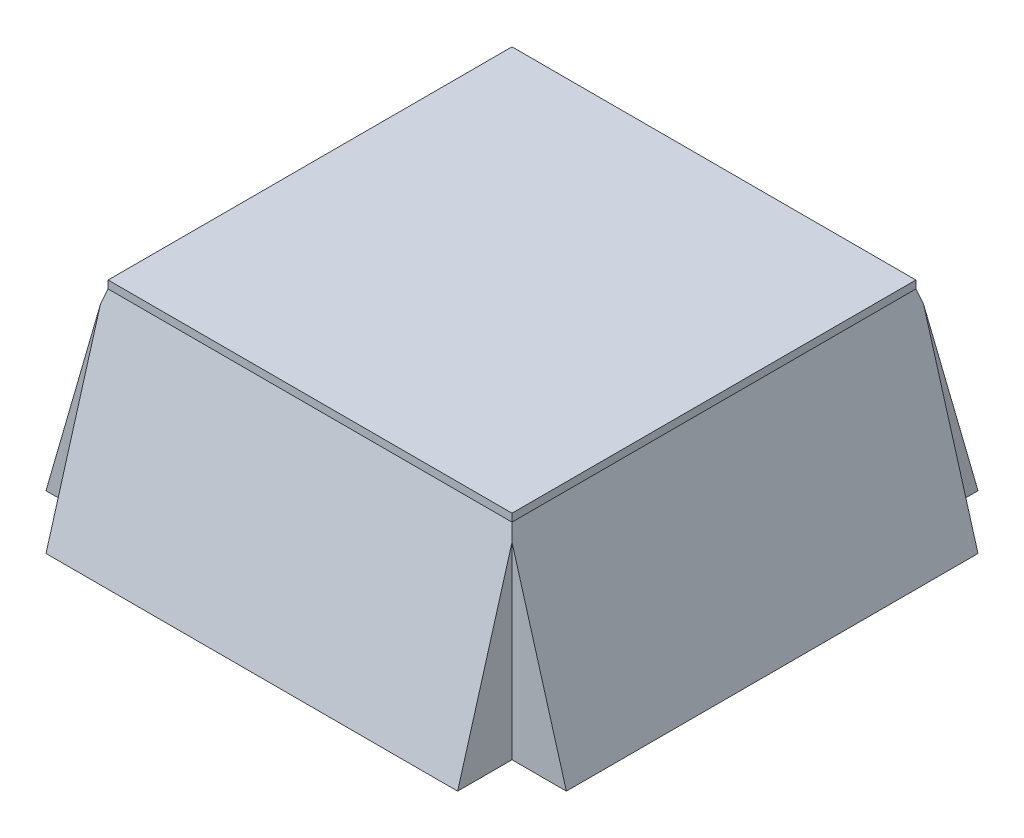
ISO-10303-21;
HEADER;
FILE_DESCRIPTION(('STEP AP214'),'2;1');
FILE_NAME('part.step','',(''),(''),'','','');
FILE_SCHEMA(('AUTOMOTIVE_DESIGN { 1 0 10303 214 1 1 1 1 }'));
ENDSEC;
DATA;
#1=APPLICATION_CONTEXT('core data for automotive mechanical design processes');
#2=APPLICATION_PROTOCOL_DEFINITION('international standard','automotive_design',2000,#1);
#3=PRODUCT_CONTEXT('',#1,'mechanical');
#4=PRODUCT('Part','Part','',(#3));
#5=PRODUCT_RELATED_PRODUCT_CATEGORY('part','',(#4));
#6=PRODUCT_DEFINITION_FORMATION('','',#4);
#7=PRODUCT_DEFINITION_CONTEXT('part definition',#1,'design');
#8=PRODUCT_DEFINITION('design','',#6,#7);
#9=PRODUCT_DEFINITION_SHAPE('','',#8);
#10=(LENGTH_UNIT() NAMED_UNIT(*) SI_UNIT(.MILLI.,.METRE.));
#11=(NAMED_UNIT(*) PLANE_ANGLE_UNIT() SI_UNIT($,.RADIAN.));
#12=(NAMED_UNIT(*) SI_UNIT($,.STERADIAN.) SOLID_ANGLE_UNIT());
#13=UNCERTAINTY_MEASURE_WITH_UNIT(LENGTH_MEASURE(1.E-05),#10,'distance_accuracy_value','');
#14=(GEOMETRIC_REPRESENTATION_CONTEXT(3) GLOBAL_UNCERTAINTY_ASSIGNED_CONTEXT((#13)) GLOBAL_UNIT_ASSIGNED_CONTEXT((#10,
#11,#12)) REPRESENTATION_CONTEXT('',''));
#15=CARTESIAN_POINT('',(0.,0.,0.));
#16=DIRECTION('',(0.,0.,1.));
#17=DIRECTION('',(1.,0.,0.));
#18=AXIS2_PLACEMENT_3D('',#15,#16,#17);
#19=CARTESIAN_POINT('',(0.,0.,67.));
#20=DIRECTION('',(0.,1.,0.));
#21=DIRECTION('',(0.,0.,1.));
#22=AXIS2_PLACEMENT_3D('',#19,#20,#21);
#23=PLANE('',#22);
#24=DIRECTION('',(1.,0.,0.));
#25=VECTOR('',#24,1.);
#26=CARTESIAN_POINT('',(65.7115384615385,0.,58.5));
#27=LINE('',#26,#25);
#28=CARTESIAN_POINT('',(58.5,0.,58.5));
#29=VERTEX_POINT('',#28);
#30=CARTESIAN_POINT('',(65.7115384615385,0.,58.5));
#31=VERTEX_POINT('',#30);
#32=EDGE_CURVE('E281',#29,#31,#27,.T.);
#33=ORIENTED_EDGE('',*,*,#32,.T.);
#34=DIRECTION('',(0.,0.,-1.));
#35=VECTOR('',#34,1.);
#36=CARTESIAN_POINT('',(65.7115384615385,0.,58.5));
#37=LINE('',#36,#35);
#38=CARTESIAN_POINT('',(65.7115384615385,0.,8.5));
#39=VERTEX_POINT('',#38);
#40=EDGE_CURVE('E298',#31,#39,#37,.T.);
#41=ORIENTED_EDGE('',*,*,#40,.T.);
#42=DIRECTION('',(1.,0.,0.));
#43=VECTOR('',#42,1.);
#44=CARTESIAN_POINT('',(65.7115384615385,0.,8.5));
#45=LINE('',#44,#43);
#46=CARTESIAN_POINT('',(58.5,0.,8.5));
#47=VERTEX_POINT('',#46);
#48=EDGE_CURVE('E273',#47,#39,#45,.T.);
#49=ORIENTED_EDGE('',*,*,#48,.F.);
#50=DIRECTION('',(0.,0.,-1.));
#51=VECTOR('',#50,1.);
#52=CARTESIAN_POINT('',(58.5,0.,67.));
#53=LINE('',#52,#51);
#54=CARTESIAN_POINT('',(58.5,0.,1.28846153846154));
#55=VERTEX_POINT('',#54);
#56=EDGE_CURVE('E425',#47,#55,#53,.T.);
#57=ORIENTED_EDGE('',*,*,#56,.T.);
#58=DIRECTION('',(-1.,0.,0.));
#59=VECTOR('',#58,1.);
#60=CARTESIAN_POINT('',(58.5,0.,1.28846153846154));
#61=LINE('',#60,#59);
#62=CARTESIAN_POINT('',(8.5,0.,1.28846153846154));
#63=VERTEX_POINT('',#62);
#64=EDGE_CURVE('E333',#55,#63,#61,.T.);
#65=ORIENTED_EDGE('',*,*,#64,.T.);
#66=DIRECTION('',(0.,0.,1.));
#67=VECTOR('',#66,1.);
#68=CARTESIAN_POINT('',(8.50000000000001,0.,67.));
#69=LINE('',#68,#67);
#70=CARTESIAN_POINT('',(8.50000000000001,0.,8.5));
#71=VERTEX_POINT('',#70);
#72=EDGE_CURVE('E422',#63,#71,#69,.T.);
#73=ORIENTED_EDGE('',*,*,#72,.T.);
#74=CARTESIAN_POINT('',(1.28846153846154,0.,8.5));
#75=VERTEX_POINT('',#74);
#76=EDGE_CURVE('E274',#75,#71,#45,.T.);
#77=ORIENTED_EDGE('',*,*,#76,.F.);
#78=DIRECTION('',(0.,0.,-1.));
#79=VECTOR('',#78,1.);
#80=CARTESIAN_POINT('',(1.28846153846154,0.,58.5));
#81=LINE('',#80,#79);
#82=CARTESIAN_POINT('',(1.28846153846154,0.,58.5));
#83=VERTEX_POINT('',#82);
#84=EDGE_CURVE('E290',#83,#75,#81,.T.);
#85=ORIENTED_EDGE('',*,*,#84,.F.);
#86=CARTESIAN_POINT('',(8.50000000000001,0.,58.5));
#87=VERTEX_POINT('',#86);
#88=EDGE_CURVE('E282',#83,#87,#27,.T.);
#89=ORIENTED_EDGE('',*,*,#88,.T.);
#90=CARTESIAN_POINT('',(8.5,0.,65.7115384615385));
#91=VERTEX_POINT('',#90);
#92=EDGE_CURVE('E421',#87,#91,#69,.T.);
#93=ORIENTED_EDGE('',*,*,#92,.T.);
#94=DIRECTION('',(-1.,0.,0.));
#95=VECTOR('',#94,1.);
#96=CARTESIAN_POINT('',(58.5,0.,65.7115384615385));
#97=LINE('',#96,#95);
#98=CARTESIAN_POINT('',(58.5,0.,65.7115384615385));
#99=VERTEX_POINT('',#98);
#100=EDGE_CURVE('E323',#99,#91,#97,.T.);
#101=ORIENTED_EDGE('',*,*,#100,.F.);
#102=EDGE_CURVE('E426',#99,#29,#53,.T.);
#103=ORIENTED_EDGE('',*,*,#102,.T.);
#104=EDGE_LOOP('',(#33,#41,#49,#57,#65,#73,#77,#85,#89,#93,#101,#103));
#105=FACE_BOUND('',#104,.T.);
#106=DIRECTION('',(0.,0.,1.));
#107=VECTOR('',#106,1.);
#108=CARTESIAN_POINT('',(60.0000000000006,0.,0.));
#109=LINE('',#108,#107);
#110=CARTESIAN_POINT('',(60.0000000000006,0.,0.));
#111=VERTEX_POINT('',#110);
#112=CARTESIAN_POINT('',(60.0000000000007,0.,6.99999999999991));
#113=VERTEX_POINT('',#112);
#114=EDGE_CURVE('E48',#111,#113,#109,.T.);
#115=ORIENTED_EDGE('',*,*,#114,.T.);
#116=DIRECTION('',(-1.,0.,0.));
#117=VECTOR('',#116,1.);
#118=CARTESIAN_POINT('',(67.0000000000007,0.,6.99999999999988));
#119=LINE('',#118,#117);
#120=CARTESIAN_POINT('',(67.0000000000007,0.,6.99999999999988));
#121=VERTEX_POINT('',#120);
#122=EDGE_CURVE('E248',#121,#113,#119,.T.);
#123=ORIENTED_EDGE('',*,*,#122,.F.);
#124=DIRECTION('',(0.,0.,-1.));
#125=VECTOR('',#124,1.);
#126=CARTESIAN_POINT('',(67.,0.,67.));
#127=LINE('',#126,#125);
#128=CARTESIAN_POINT('',(67.,0.,60.));
#129=VERTEX_POINT('',#128);
#130=EDGE_CURVE('E415',#129,#121,#127,.T.);
#131=ORIENTED_EDGE('',*,*,#130,.F.);
#132=DIRECTION('',(-1.,0.,0.));
#133=VECTOR('',#132,1.);
#134=CARTESIAN_POINT('',(67.,0.,60.));
#135=LINE('',#134,#133);
#136=CARTESIAN_POINT('',(60.,0.,60.));
#137=VERTEX_POINT('',#136);
#138=EDGE_CURVE('E245',#129,#137,#135,.T.);
#139=ORIENTED_EDGE('',*,*,#138,.T.);
#140=DIRECTION('',(0.,0.,-1.));
#141=VECTOR('',#140,1.);
#142=CARTESIAN_POINT('',(60.,0.,67.));
#143=LINE('',#142,#141);
#144=CARTESIAN_POINT('',(60.,0.,67.));
#145=VERTEX_POINT('',#144);
#146=EDGE_CURVE('E257',#145,#137,#143,.T.);
#147=ORIENTED_EDGE('',*,*,#146,.F.);
#148=DIRECTION('',(1.,0.,0.));
#149=VECTOR('',#148,1.);
#150=CARTESIAN_POINT('',(0.,0.,67.));
#151=LINE('',#150,#149);
#152=CARTESIAN_POINT('',(7.00000000000034,0.,67.));
#153=VERTEX_POINT('',#152);
#154=EDGE_CURVE('E405',#153,#145,#151,.T.);
#155=ORIENTED_EDGE('',*,*,#154,.F.);
#156=DIRECTION('',(0.,0.,-1.));
#157=VECTOR('',#156,1.);
#158=CARTESIAN_POINT('',(7.00000000000035,0.,66.9999999999995));
#159=LINE('',#158,#157);
#160=CARTESIAN_POINT('',(7.00000000000028,0.,59.9999999999995));
#161=VERTEX_POINT('',#160);
#162=EDGE_CURVE('E238',#153,#161,#159,.T.);
#163=ORIENTED_EDGE('',*,*,#162,.T.);
#164=DIRECTION('',(1.,0.,0.));
#165=VECTOR('',#164,1.);
#166=CARTESIAN_POINT('',(2.63677968348475E-13,0.,59.9999999999996));
#167=LINE('',#166,#165);
#168=CARTESIAN_POINT('',(2.63677968348475E-13,0.,59.9999999999996));
#169=VERTEX_POINT('',#168);
#170=EDGE_CURVE('E242',#169,#161,#167,.T.);
#171=ORIENTED_EDGE('',*,*,#170,.F.);
#172=DIRECTION('',(0.,0.,-1.));
#173=VECTOR('',#172,1.);
#174=CARTESIAN_POINT('',(0.,0.,67.));
#175=LINE('',#174,#173);
#176=CARTESIAN_POINT('',(5.68989300120393E-13,0.,6.99999999999949));
#177=VERTEX_POINT('',#176);
#178=EDGE_CURVE('E418',#169,#177,#175,.T.);
#179=ORIENTED_EDGE('',*,*,#178,.T.);
#180=DIRECTION('',(1.,0.,0.));
#181=VECTOR('',#180,1.);
#182=CARTESIAN_POINT('',(5.68989300120393E-13,0.,6.99999999999949));
#183=LINE('',#182,#181);
#184=CARTESIAN_POINT('',(7.00000000000058,0.,6.99999999999944));
#185=VERTEX_POINT('',#184);
#186=EDGE_CURVE('E247',#177,#185,#183,.T.);
#187=ORIENTED_EDGE('',*,*,#186,.T.);
#188=DIRECTION('',(0.,0.,1.));
#189=VECTOR('',#188,1.);
#190=CARTESIAN_POINT('',(7.00000000000053,0.,-5.68989300120393E-13));
#191=LINE('',#190,#189);
#192=CARTESIAN_POINT('',(7.00000000000053,0.,-5.68989300120393E-13));
#193=VERTEX_POINT('',#192);
#194=EDGE_CURVE('E239',#193,#185,#191,.T.);
#195=ORIENTED_EDGE('',*,*,#194,.F.);
#196=DIRECTION('',(1.,0.,0.));
#197=VECTOR('',#196,1.);
#198=CARTESIAN_POINT('',(0.,0.,0.));
#199=LINE('',#198,#197);
#200=EDGE_CURVE('E404',#193,#111,#199,.T.);
#201=ORIENTED_EDGE('',*,*,#200,.T.);
#202=EDGE_LOOP('',(#115,#123,#131,#139,#147,#155,#163,#171,#179,#187,#195,#201));
#203=FACE_BOUND('',#202,.T.);
#204=ADVANCED_FACE('F33',(#105,#203),#23,.F.);
#205=CARTESIAN_POINT('',(7.5,26.,67.));
#206=DIRECTION('',(0.960823591180895,-0.277160651302181,0.));
#207=DIRECTION('',(0.277160651302181,0.960823591180895,0.));
#208=AXIS2_PLACEMENT_3D('',#205,#206,#207);
#209=PLANE('',#208);
#210=DIRECTION('',(0.277160651302181,0.960823591180895,0.));
#211=VECTOR('',#210,1.);
#212=CARTESIAN_POINT('',(7.49999999999997,25.9999999999999,6.99999999999944));
#213=LINE('',#212,#211);
#214=CARTESIAN_POINT('',(7.0000000000006,24.2666666666688,7.00000000000063));
#215=VERTEX_POINT('',#214);
#216=EDGE_CURVE('E268',#177,#215,#213,.T.);
#217=ORIENTED_EDGE('',*,*,#216,.F.);
#218=ORIENTED_EDGE('',*,*,#178,.F.);
#219=DIRECTION('',(0.277160651302181,0.960823591180895,0.));
#220=VECTOR('',#219,1.);
#221=CARTESIAN_POINT('',(7.49999999999999,26.,59.9999999999995));
#222=LINE('',#221,#220);
#223=CARTESIAN_POINT('',(7.00000000000028,24.2666666666682,59.9999999999995));
#224=VERTEX_POINT('',#223);
#225=EDGE_CURVE('E265',#169,#224,#222,.T.);
#226=ORIENTED_EDGE('',*,*,#225,.T.);
#227=DIRECTION('',(-0.267091713673411,-0.925917940734491,0.267091713673411));
#228=VECTOR('',#227,1.);
#229=CARTESIAN_POINT('',(6.9649651236525,24.145212428662,60.0350348763475));
#230=LINE('',#229,#228);
#231=CARTESIAN_POINT('',(7.50000000000001,26.,59.5));
#232=VERTEX_POINT('',#231);
#233=EDGE_CURVE('E401',#232,#224,#230,.T.);
#234=ORIENTED_EDGE('',*,*,#233,.F.);
#235=DIRECTION('',(0.,0.,-1.));
#236=VECTOR('',#235,1.);
#237=CARTESIAN_POINT('',(7.5,26.,67.));
#238=LINE('',#237,#236);
#239=CARTESIAN_POINT('',(7.50000000000001,26.,7.5));
#240=VERTEX_POINT('',#239);
#241=EDGE_CURVE('E408',#232,#240,#238,.T.);
#242=ORIENTED_EDGE('',*,*,#241,.T.);
#243=DIRECTION('',(0.267091713673411,0.925917940734491,0.267091713673411));
#244=VECTOR('',#243,1.);
#245=CARTESIAN_POINT('',(11.7446100190235,40.714648065948,11.7446100190235));
#246=LINE('',#245,#244);
#247=EDGE_CURVE('E396',#215,#240,#246,.T.);
#248=ORIENTED_EDGE('',*,*,#247,.F.);
#249=EDGE_LOOP('',(#217,#218,#226,#234,#242,#248));
#250=FACE_BOUND('',#249,.T.);
#251=ADVANCED_FACE('F35',(#250),#209,.F.);
#252=CARTESIAN_POINT('',(67.,0.,67.));
#253=DIRECTION('',(-0.960823591180894,-0.277160651302181,0.));
#254=DIRECTION('',(0.277160651302181,-0.960823591180895,0.));
#255=AXIS2_PLACEMENT_3D('',#252,#253,#254);
#256=PLANE('',#255);
#257=ORIENTED_EDGE('',*,*,#130,.T.);
#258=DIRECTION('',(-0.277160651302181,0.960823591180895,0.));
#259=VECTOR('',#258,1.);
#260=CARTESIAN_POINT('',(67.,0.,6.99999999999988));
#261=LINE('',#260,#259);
#262=CARTESIAN_POINT('',(60.0000000000007,24.2666666666663,6.99999999999991));
#263=VERTEX_POINT('',#262);
#264=EDGE_CURVE('E270',#121,#263,#261,.T.);
#265=ORIENTED_EDGE('',*,*,#264,.T.);
#266=DIRECTION('',(0.267091713673411,-0.925917940734491,-0.267091713673411));
#267=VECTOR('',#266,1.);
#268=CARTESIAN_POINT('',(62.220355104629,16.569435637286,4.77964489537098));
#269=LINE('',#268,#267);
#270=CARTESIAN_POINT('',(59.5,26.,7.5));
#271=VERTEX_POINT('',#270);
#272=EDGE_CURVE('E391',#271,#263,#269,.T.);
#273=ORIENTED_EDGE('',*,*,#272,.F.);
#274=DIRECTION('',(0.,0.,-1.));
#275=VECTOR('',#274,1.);
#276=CARTESIAN_POINT('',(59.5,26.,67.));
#277=LINE('',#276,#275);
#278=CARTESIAN_POINT('',(59.5,26.,59.5));
#279=VERTEX_POINT('',#278);
#280=EDGE_CURVE('E413',#279,#271,#277,.T.);
#281=ORIENTED_EDGE('',*,*,#280,.F.);
#282=DIRECTION('',(-0.267091713673411,0.925917940734491,-0.267091713673411));
#283=VECTOR('',#282,1.);
#284=CARTESIAN_POINT('',(67.,0.,67.));
#285=LINE('',#284,#283);
#286=CARTESIAN_POINT('',(60.,24.2666666666667,60.));
#287=VERTEX_POINT('',#286);
#288=EDGE_CURVE('E399',#287,#279,#285,.T.);
#289=ORIENTED_EDGE('',*,*,#288,.F.);
#290=DIRECTION('',(-0.277160651302181,0.960823591180895,0.));
#291=VECTOR('',#290,1.);
#292=CARTESIAN_POINT('',(67.,0.,60.));
#293=LINE('',#292,#291);
#294=EDGE_CURVE('E262',#129,#287,#293,.T.);
#295=ORIENTED_EDGE('',*,*,#294,.F.);
#296=EDGE_LOOP('',(#257,#265,#273,#281,#289,#295));
#297=FACE_BOUND('',#296,.T.);
#298=ADVANCED_FACE('F451',(#297),#256,.F.);
#299=CARTESIAN_POINT('',(107.,0.,0.));
#300=DIRECTION('',(0.,0.277160651302181,-0.960823591180894));
#301=DIRECTION('',(0.,0.960823591180895,0.277160651302181));
#302=AXIS2_PLACEMENT_3D('',#299,#300,#301);
#303=PLANE('',#302);
#304=ORIENTED_EDGE('',*,*,#272,.T.);
#305=DIRECTION('',(0.,-0.960823591180895,-0.277160651302181));
#306=VECTOR('',#305,1.);
#307=CARTESIAN_POINT('',(60.0000000000006,0.,0.));
#308=LINE('',#307,#306);
#309=EDGE_CURVE('E11',#263,#111,#308,.T.);
#310=ORIENTED_EDGE('',*,*,#309,.T.);
#311=ORIENTED_EDGE('',*,*,#200,.F.);
#312=DIRECTION('',(0.,-0.960823591180895,-0.277160651302181));
#313=VECTOR('',#312,1.);
#314=CARTESIAN_POINT('',(7.00000000000053,1.84784474054203E-13,0.));
#315=LINE('',#314,#313);
#316=EDGE_CURVE('E41',#215,#193,#315,.T.);
#317=ORIENTED_EDGE('',*,*,#316,.F.);
#318=ORIENTED_EDGE('',*,*,#247,.T.);
#319=DIRECTION('',(-1.,0.,0.));
#320=VECTOR('',#319,1.);
#321=CARTESIAN_POINT('',(107.,26.,7.5));
#322=LINE('',#321,#320);
#323=EDGE_CURVE('E369',#271,#240,#322,.T.);
#324=ORIENTED_EDGE('',*,*,#323,.F.);
#325=EDGE_LOOP('',(#304,#310,#311,#317,#318,#324));
#326=FACE_BOUND('',#325,.T.);
#327=ADVANCED_FACE('F442',(#326),#303,.T.);
#328=CARTESIAN_POINT('',(107.,0.,67.));
#329=DIRECTION('',(0.,0.277160651302181,0.960823591180894));
#330=DIRECTION('',(0.,-0.960823591180894,0.277160651302181));
#331=AXIS2_PLACEMENT_3D('',#328,#329,#330);
#332=PLANE('',#331);
#333=ORIENTED_EDGE('',*,*,#233,.T.);
#334=DIRECTION('',(0.,-0.960823591180894,0.277160651302181));
#335=VECTOR('',#334,1.);
#336=CARTESIAN_POINT('',(7.00000000000034,-2.63977820077434E-13,67.0000000000001));
#337=LINE('',#336,#335);
#338=EDGE_CURVE('E433',#224,#153,#337,.T.);
#339=ORIENTED_EDGE('',*,*,#338,.T.);
#340=ORIENTED_EDGE('',*,*,#154,.T.);
#341=DIRECTION('',(0.,-0.960823591180894,0.277160651302181));
#342=VECTOR('',#341,1.);
#343=CARTESIAN_POINT('',(60.,0.,67.));
#344=LINE('',#343,#342);
#345=EDGE_CURVE('E431',#287,#145,#344,.T.);
#346=ORIENTED_EDGE('',*,*,#345,.F.);
#347=ORIENTED_EDGE('',*,*,#288,.T.);
#348=DIRECTION('',(-1.,0.,0.));
#349=VECTOR('',#348,1.);
#350=CARTESIAN_POINT('',(107.,26.,59.5));
#351=LINE('',#350,#349);
#352=EDGE_CURVE('E227',#279,#232,#351,.T.);
#353=ORIENTED_EDGE('',*,*,#352,.T.);
#354=EDGE_LOOP('',(#333,#339,#340,#346,#347,#353));
#355=FACE_BOUND('',#354,.T.);
#356=ADVANCED_FACE('F464',(#355),#332,.T.);
#357=CARTESIAN_POINT('',(58.5,-81.,8.5));
#358=DIRECTION('',(1.,0.,0.));
#359=DIRECTION('',(0.,0.,-1.));
#360=AXIS2_PLACEMENT_3D('',#357,#358,#359);
#361=PLANE('',#360);
#362=DIRECTION('',(0.,1.,0.));
#363=VECTOR('',#362,1.);
#364=CARTESIAN_POINT('',(58.5,-81.,58.5));
#365=LINE('',#364,#363);
#366=CARTESIAN_POINT('',(58.5,25.,58.5));
#367=VERTEX_POINT('',#366);
#368=EDGE_CURVE('E303',#29,#367,#365,.T.);
#369=ORIENTED_EDGE('',*,*,#368,.F.);
#370=ORIENTED_EDGE('',*,*,#102,.F.);
#371=DIRECTION('',(0.,-0.960823591180894,0.277160651302181));
#372=VECTOR('',#371,1.);
#373=CARTESIAN_POINT('',(58.5,0.,65.7115384615385));
#374=LINE('',#373,#372);
#375=EDGE_CURVE('E320',#367,#99,#374,.T.);
#376=ORIENTED_EDGE('',*,*,#375,.F.);
#377=EDGE_LOOP('',(#369,#370,#376));
#378=FACE_BOUND('',#377,.T.);
#379=ADVANCED_FACE('F506',(#378),#361,.F.);
#380=DIRECTION('',(0.,0.,-1.));
#381=VECTOR('',#380,1.);
#382=CARTESIAN_POINT('',(58.5,25.,58.5));
#383=LINE('',#382,#381);
#384=CARTESIAN_POINT('',(58.5,25.,8.5));
#385=VERTEX_POINT('',#384);
#386=EDGE_CURVE('E295',#367,#385,#383,.T.);
#387=ORIENTED_EDGE('',*,*,#386,.F.);
#388=DIRECTION('',(0.,1.,0.));
#389=VECTOR('',#388,1.);
#390=CARTESIAN_POINT('',(58.5,-81.,58.5));
#391=LINE('',#390,#389);
#392=CARTESIAN_POINT('',(58.5,26.,58.5));
#393=VERTEX_POINT('',#392);
#394=EDGE_CURVE('E376',#367,#393,#391,.T.);
#395=ORIENTED_EDGE('',*,*,#394,.T.);
#396=DIRECTION('',(0.,0.,-1.));
#397=VECTOR('',#396,1.);
#398=CARTESIAN_POINT('',(58.5,26.,8.5));
#399=LINE('',#398,#397);
#400=CARTESIAN_POINT('',(58.5,26.,8.5));
#401=VERTEX_POINT('',#400);
#402=EDGE_CURVE('E356',#393,#401,#399,.T.);
#403=ORIENTED_EDGE('',*,*,#402,.T.);
#404=DIRECTION('',(0.,1.,0.));
#405=VECTOR('',#404,1.);
#406=CARTESIAN_POINT('',(58.5,-81.,8.5));
#407=LINE('',#406,#405);
#408=EDGE_CURVE('E373',#385,#401,#407,.T.);
#409=ORIENTED_EDGE('',*,*,#408,.F.);
#410=EDGE_LOOP('',(#387,#395,#403,#409));
#411=FACE_BOUND('',#410,.T.);
#412=ADVANCED_FACE('F536',(#411),#361,.F.);
#413=CARTESIAN_POINT('',(8.50000000000001,-81.,58.5));
#414=DIRECTION('',(-1.,0.,0.));
#415=DIRECTION('',(0.,0.,1.));
#416=AXIS2_PLACEMENT_3D('',#413,#414,#415);
#417=PLANE('',#416);
#418=DIRECTION('',(0.,-1.,0.));
#419=VECTOR('',#418,1.);
#420=CARTESIAN_POINT('',(8.50000000000001,-81.,58.5));
#421=LINE('',#420,#419);
#422=CARTESIAN_POINT('',(8.5,25.,58.5));
#423=VERTEX_POINT('',#422);
#424=EDGE_CURVE('E301',#423,#87,#421,.T.);
#425=ORIENTED_EDGE('',*,*,#424,.F.);
#426=DIRECTION('',(0.,-0.960823591180894,0.277160651302181));
#427=VECTOR('',#426,1.);
#428=CARTESIAN_POINT('',(8.5,0.,65.7115384615385));
#429=LINE('',#428,#427);
#430=EDGE_CURVE('E314',#423,#91,#429,.T.);
#431=ORIENTED_EDGE('',*,*,#430,.T.);
#432=ORIENTED_EDGE('',*,*,#92,.F.);
#433=EDGE_LOOP('',(#425,#431,#432));
#434=FACE_BOUND('',#433,.T.);
#435=ADVANCED_FACE('F528',(#434),#417,.F.);
#436=DIRECTION('',(0.,0.,-1.));
#437=VECTOR('',#436,1.);
#438=CARTESIAN_POINT('',(8.5,25.,58.5));
#439=LINE('',#438,#437);
#440=CARTESIAN_POINT('',(8.5,25.,8.5));
#441=VERTEX_POINT('',#440);
#442=EDGE_CURVE('E292',#423,#441,#439,.T.);
#443=ORIENTED_EDGE('',*,*,#442,.T.);
#444=DIRECTION('',(0.,1.,0.));
#445=VECTOR('',#444,1.);
#446=CARTESIAN_POINT('',(8.50000000000001,-81.,8.5));
#447=LINE('',#446,#445);
#448=CARTESIAN_POINT('',(8.50000000000001,26.,8.5));
#449=VERTEX_POINT('',#448);
#450=EDGE_CURVE('E382',#441,#449,#447,.T.);
#451=ORIENTED_EDGE('',*,*,#450,.T.);
#452=DIRECTION('',(0.,0.,1.));
#453=VECTOR('',#452,1.);
#454=CARTESIAN_POINT('',(8.50000000000001,26.,58.5));
#455=LINE('',#454,#453);
#456=CARTESIAN_POINT('',(8.50000000000001,26.,58.5));
#457=VERTEX_POINT('',#456);
#458=EDGE_CURVE('E350',#449,#457,#455,.T.);
#459=ORIENTED_EDGE('',*,*,#458,.T.);
#460=DIRECTION('',(0.,1.,0.));
#461=VECTOR('',#460,1.);
#462=CARTESIAN_POINT('',(8.50000000000001,-81.,58.5));
#463=LINE('',#462,#461);
#464=EDGE_CURVE('E379',#423,#457,#463,.T.);
#465=ORIENTED_EDGE('',*,*,#464,.F.);
#466=EDGE_LOOP('',(#443,#451,#459,#465));
#467=FACE_BOUND('',#466,.T.);
#468=ADVANCED_FACE('F511',(#467),#417,.F.);
#469=CARTESIAN_POINT('',(33.5,-81.,33.5));
#470=DIRECTION('',(0.,1.,0.));
#471=DIRECTION('',(0.,0.,1.));
#472=AXIS2_PLACEMENT_3D('',#469,#470,#471);
#473=CYLINDRICAL_SURFACE('',#472,1.25000000000001);
#474=CARTESIAN_POINT('',(33.5,25.,33.5));
#475=DIRECTION('',(0.,-1.,0.));
#476=DIRECTION('',(0.,0.,-1.));
#477=AXIS2_PLACEMENT_3D('',#474,#475,#476);
#478=CIRCLE('',#477,1.25000000000001);
#479=CARTESIAN_POINT('',(34.,25.,32.354356076261));
#480=VERTEX_POINT('',#479);
#481=CARTESIAN_POINT('',(33.,25.,32.354356076261));
#482=VERTEX_POINT('',#481);
#483=EDGE_CURVE('E337',#480,#482,#478,.T.);
#484=ORIENTED_EDGE('',*,*,#483,.F.);
#485=DIRECTION('',(0.,1.,0.));
#486=VECTOR('',#485,1.);
#487=CARTESIAN_POINT('',(34.,-81.,32.3543560762611));
#488=LINE('',#487,#486);
#489=CARTESIAN_POINT('',(34.,26.,32.3543560762611));
#490=VERTEX_POINT('',#489);
#491=EDGE_CURVE('E366',#480,#490,#488,.T.);
#492=ORIENTED_EDGE('',*,*,#491,.T.);
#493=CARTESIAN_POINT('',(33.5,26.,33.5));
#494=DIRECTION('',(0.,-1.,0.));
#495=DIRECTION('',(0.,0.,1.));
#496=AXIS2_PLACEMENT_3D('',#493,#494,#495);
#497=CIRCLE('',#496,1.25000000000001);
#498=CARTESIAN_POINT('',(33.,26.,32.354356076261));
#499=VERTEX_POINT('',#498);
#500=EDGE_CURVE('E341',#490,#499,#497,.T.);
#501=ORIENTED_EDGE('',*,*,#500,.T.);
#502=DIRECTION('',(0.,1.,0.));
#503=VECTOR('',#502,1.);
#504=CARTESIAN_POINT('',(33.,-81.,32.354356076261));
#505=LINE('',#504,#503);
#506=EDGE_CURVE('E365',#482,#499,#505,.T.);
#507=ORIENTED_EDGE('',*,*,#506,.F.);
#508=EDGE_LOOP('',(#484,#492,#501,#507));
#509=FACE_BOUND('',#508,.T.);
#510=ADVANCED_FACE('F507',(#509),#473,.T.);
#511=CARTESIAN_POINT('',(34.,-81.,32.3543560762611));
#512=DIRECTION('',(-1.,0.,0.));
#513=DIRECTION('',(0.,0.,1.));
#514=AXIS2_PLACEMENT_3D('',#511,#512,#513);
#515=PLANE('',#514);
#516=DIRECTION('',(0.,0.,1.));
#517=VECTOR('',#516,1.);
#518=CARTESIAN_POINT('',(34.,25.,32.3543560762611));
#519=LINE('',#518,#517);
#520=CARTESIAN_POINT('',(34.,25.,8.5));
#521=VERTEX_POINT('',#520);
#522=EDGE_CURVE('E339',#521,#480,#519,.T.);
#523=ORIENTED_EDGE('',*,*,#522,.F.);
#524=DIRECTION('',(0.,1.,0.));
#525=VECTOR('',#524,1.);
#526=CARTESIAN_POINT('',(34.,-81.,8.5));
#527=LINE('',#526,#525);
#528=CARTESIAN_POINT('',(34.,26.,8.5));
#529=VERTEX_POINT('',#528);
#530=EDGE_CURVE('E370',#521,#529,#527,.T.);
#531=ORIENTED_EDGE('',*,*,#530,.T.);
#532=DIRECTION('',(0.,0.,1.));
#533=VECTOR('',#532,1.);
#534=CARTESIAN_POINT('',(34.,26.,32.3543560762611));
#535=LINE('',#534,#533);
#536=EDGE_CURVE('E362',#529,#490,#535,.T.);
#537=ORIENTED_EDGE('',*,*,#536,.T.);
#538=ORIENTED_EDGE('',*,*,#491,.F.);
#539=EDGE_LOOP('',(#523,#531,#537,#538));
#540=FACE_BOUND('',#539,.T.);
#541=ADVANCED_FACE('F510',(#540),#515,.F.);
#542=CARTESIAN_POINT('',(34.,-81.,8.5));
#543=DIRECTION('',(0.,0.,-1.));
#544=DIRECTION('',(-1.,0.,0.));
#545=AXIS2_PLACEMENT_3D('',#542,#543,#544);
#546=PLANE('',#545);
#547=DIRECTION('',(-1.,0.,0.));
#548=VECTOR('',#547,1.);
#549=CARTESIAN_POINT('',(58.5,25.,8.5));
#550=LINE('',#549,#548);
#551=EDGE_CURVE('E330',#385,#521,#550,.T.);
#552=ORIENTED_EDGE('',*,*,#551,.F.);
#553=ORIENTED_EDGE('',*,*,#408,.T.);
#554=DIRECTION('',(-1.,0.,0.));
#555=VECTOR('',#554,1.);
#556=CARTESIAN_POINT('',(34.,26.,8.5));
#557=LINE('',#556,#555);
#558=EDGE_CURVE('E359',#401,#529,#557,.T.);
#559=ORIENTED_EDGE('',*,*,#558,.T.);
#560=ORIENTED_EDGE('',*,*,#530,.F.);
#561=EDGE_LOOP('',(#552,#553,#559,#560));
#562=FACE_BOUND('',#561,.T.);
#563=ADVANCED_FACE('F531',(#562),#546,.F.);
#564=CARTESIAN_POINT('',(58.5,-81.,58.5));
#565=DIRECTION('',(0.,0.,1.));
#566=DIRECTION('',(1.,0.,0.));
#567=AXIS2_PLACEMENT_3D('',#564,#565,#566);
#568=PLANE('',#567);
#569=DIRECTION('',(-1.,0.,0.));
#570=VECTOR('',#569,1.);
#571=CARTESIAN_POINT('',(58.5,25.,58.5));
#572=LINE('',#571,#570);
#573=EDGE_CURVE('E326',#367,#423,#572,.T.);
#574=ORIENTED_EDGE('',*,*,#573,.T.);
#575=ORIENTED_EDGE('',*,*,#464,.T.);
#576=DIRECTION('',(1.,0.,0.));
#577=VECTOR('',#576,1.);
#578=CARTESIAN_POINT('',(58.5,26.,58.5));
#579=LINE('',#578,#577);
#580=EDGE_CURVE('E353',#457,#393,#579,.T.);
#581=ORIENTED_EDGE('',*,*,#580,.T.);
#582=ORIENTED_EDGE('',*,*,#394,.F.);
#583=EDGE_LOOP('',(#574,#575,#581,#582));
#584=FACE_BOUND('',#583,.T.);
#585=ADVANCED_FACE('F521',(#584),#568,.F.);
#586=CARTESIAN_POINT('',(8.50000000000001,-81.,8.5));
#587=DIRECTION('',(0.,0.,-1.));
#588=DIRECTION('',(-1.,0.,0.));
#589=AXIS2_PLACEMENT_3D('',#586,#587,#588);
#590=PLANE('',#589);
#591=CARTESIAN_POINT('',(33.,25.,8.5));
#592=VERTEX_POINT('',#591);
#593=EDGE_CURVE('E329',#592,#441,#550,.T.);
#594=ORIENTED_EDGE('',*,*,#593,.F.);
#595=DIRECTION('',(0.,1.,0.));
#596=VECTOR('',#595,1.);
#597=CARTESIAN_POINT('',(33.,-81.,8.50000000000001));
#598=LINE('',#597,#596);
#599=CARTESIAN_POINT('',(33.,26.,8.50000000000001));
#600=VERTEX_POINT('',#599);
#601=EDGE_CURVE('E385',#592,#600,#598,.T.);
#602=ORIENTED_EDGE('',*,*,#601,.T.);
#603=DIRECTION('',(-1.,0.,0.));
#604=VECTOR('',#603,1.);
#605=CARTESIAN_POINT('',(8.50000000000001,26.,8.5));
#606=LINE('',#605,#604);
#607=EDGE_CURVE('E347',#600,#449,#606,.T.);
#608=ORIENTED_EDGE('',*,*,#607,.T.);
#609=ORIENTED_EDGE('',*,*,#450,.F.);
#610=EDGE_LOOP('',(#594,#602,#608,#609));
#611=FACE_BOUND('',#610,.T.);
#612=ADVANCED_FACE('F517',(#611),#590,.F.);
#613=CARTESIAN_POINT('',(33.,-81.,32.354356076261));
#614=DIRECTION('',(1.,0.,0.));
#615=DIRECTION('',(0.,0.,-1.));
#616=AXIS2_PLACEMENT_3D('',#613,#614,#615);
#617=PLANE('',#616);
#618=DIRECTION('',(0.,0.,-1.));
#619=VECTOR('',#618,1.);
#620=CARTESIAN_POINT('',(33.,25.,32.354356076261));
#621=LINE('',#620,#619);
#622=EDGE_CURVE('E429',#482,#592,#621,.T.);
#623=ORIENTED_EDGE('',*,*,#622,.F.);
#624=ORIENTED_EDGE('',*,*,#506,.T.);
#625=DIRECTION('',(0.,0.,-1.));
#626=VECTOR('',#625,1.);
#627=CARTESIAN_POINT('',(33.,26.,32.354356076261));
#628=LINE('',#627,#626);
#629=EDGE_CURVE('E344',#499,#600,#628,.T.);
#630=ORIENTED_EDGE('',*,*,#629,.T.);
#631=ORIENTED_EDGE('',*,*,#601,.F.);
#632=EDGE_LOOP('',(#623,#624,#630,#631));
#633=FACE_BOUND('',#632,.T.);
#634=ADVANCED_FACE('F513',(#633),#617,.F.);
#635=ORIENTED_EDGE('',*,*,#56,.F.);
#636=DIRECTION('',(0.,1.,0.));
#637=VECTOR('',#636,1.);
#638=CARTESIAN_POINT('',(58.5,-81.,8.5));
#639=LINE('',#638,#637);
#640=EDGE_CURVE('E308',#47,#385,#639,.T.);
#641=ORIENTED_EDGE('',*,*,#640,.T.);
#642=DIRECTION('',(0.,0.960823591180895,0.277160651302181));
#643=VECTOR('',#642,1.);
#644=CARTESIAN_POINT('',(58.5,25.,8.5));
#645=LINE('',#644,#643);
#646=EDGE_CURVE('E317',#55,#385,#645,.T.);
#647=ORIENTED_EDGE('',*,*,#646,.F.);
#648=EDGE_LOOP('',(#635,#641,#647));
#649=FACE_BOUND('',#648,.T.);
#650=ADVANCED_FACE('F516',(#649),#361,.F.);
#651=DIRECTION('',(0.,0.960823591180895,0.277160651302181));
#652=VECTOR('',#651,1.);
#653=CARTESIAN_POINT('',(8.5,25.,8.5));
#654=LINE('',#653,#652);
#655=EDGE_CURVE('E311',#63,#441,#654,.T.);
#656=ORIENTED_EDGE('',*,*,#655,.T.);
#657=DIRECTION('',(0.,-1.,0.));
#658=VECTOR('',#657,1.);
#659=CARTESIAN_POINT('',(8.50000000000001,-81.,8.5));
#660=LINE('',#659,#658);
#661=EDGE_CURVE('E305',#441,#71,#660,.T.);
#662=ORIENTED_EDGE('',*,*,#661,.T.);
#663=ORIENTED_EDGE('',*,*,#72,.F.);
#664=EDGE_LOOP('',(#656,#662,#663));
#665=FACE_BOUND('',#664,.T.);
#666=ADVANCED_FACE('F523',(#665),#417,.F.);
#667=CARTESIAN_POINT('',(58.5,25.,58.5));
#668=DIRECTION('',(0.,-1.,0.));
#669=DIRECTION('',(0.,0.,-1.));
#670=AXIS2_PLACEMENT_3D('',#667,#668,#669);
#671=PLANE('',#670);
#672=ORIENTED_EDGE('',*,*,#522,.T.);
#673=ORIENTED_EDGE('',*,*,#483,.T.);
#674=ORIENTED_EDGE('',*,*,#622,.T.);
#675=EDGE_CURVE('E334',#521,#592,#550,.T.);
#676=ORIENTED_EDGE('',*,*,#675,.F.);
#677=EDGE_LOOP('',(#672,#673,#674,#676));
#678=FACE_BOUND('',#677,.T.);
#679=ADVANCED_FACE('F526',(#678),#671,.T.);
#680=CARTESIAN_POINT('',(58.5,25.,8.5));
#681=DIRECTION('',(0.,-0.277160651302181,0.960823591180895));
#682=DIRECTION('',(0.,-0.960823591180895,-0.277160651302181));
#683=AXIS2_PLACEMENT_3D('',#680,#681,#682);
#684=PLANE('',#683);
#685=ORIENTED_EDGE('',*,*,#64,.F.);
#686=ORIENTED_EDGE('',*,*,#646,.T.);
#687=ORIENTED_EDGE('',*,*,#551,.T.);
#688=ORIENTED_EDGE('',*,*,#675,.T.);
#689=ORIENTED_EDGE('',*,*,#593,.T.);
#690=ORIENTED_EDGE('',*,*,#655,.F.);
#691=EDGE_LOOP('',(#685,#686,#687,#688,#689,#690));
#692=FACE_BOUND('',#691,.T.);
#693=ADVANCED_FACE('F543',(#692),#684,.T.);
#694=CARTESIAN_POINT('',(58.5,0.,65.7115384615385));
#695=DIRECTION('',(0.,-0.277160651302181,-0.960823591180894));
#696=DIRECTION('',(0.,0.960823591180894,-0.277160651302181));
#697=AXIS2_PLACEMENT_3D('',#694,#695,#696);
#698=PLANE('',#697);
#699=ORIENTED_EDGE('',*,*,#573,.F.);
#700=ORIENTED_EDGE('',*,*,#375,.T.);
#701=ORIENTED_EDGE('',*,*,#100,.T.);
#702=ORIENTED_EDGE('',*,*,#430,.F.);
#703=EDGE_LOOP('',(#699,#700,#701,#702));
#704=FACE_BOUND('',#703,.T.);
#705=ADVANCED_FACE('F546',(#704),#698,.T.);
#706=CARTESIAN_POINT('',(0.,0.,58.5));
#707=DIRECTION('',(0.,0.,-1.));
#708=DIRECTION('',(-1.,0.,0.));
#709=AXIS2_PLACEMENT_3D('',#706,#707,#708);
#710=PLANE('',#709);
#711=ORIENTED_EDGE('',*,*,#424,.T.);
#712=ORIENTED_EDGE('',*,*,#88,.F.);
#713=DIRECTION('',(-0.277160651302181,-0.960823591180894,0.));
#714=VECTOR('',#713,1.);
#715=CARTESIAN_POINT('',(1.28846153846154,0.,58.5));
#716=LINE('',#715,#714);
#717=EDGE_CURVE('E288',#423,#83,#716,.T.);
#718=ORIENTED_EDGE('',*,*,#717,.F.);
#719=EDGE_LOOP('',(#711,#712,#718));
#720=FACE_BOUND('',#719,.T.);
#721=ADVANCED_FACE('F553',(#720),#710,.T.);
#722=CARTESIAN_POINT('',(0.,0.,8.5));
#723=DIRECTION('',(0.,0.,-1.));
#724=DIRECTION('',(-1.,0.,0.));
#725=AXIS2_PLACEMENT_3D('',#722,#723,#724);
#726=PLANE('',#725);
#727=DIRECTION('',(-0.277160651302181,-0.960823591180894,0.));
#728=VECTOR('',#727,1.);
#729=CARTESIAN_POINT('',(1.28846153846154,0.,8.5));
#730=LINE('',#729,#728);
#731=EDGE_CURVE('E278',#441,#75,#730,.T.);
#732=ORIENTED_EDGE('',*,*,#731,.T.);
#733=ORIENTED_EDGE('',*,*,#76,.T.);
#734=ORIENTED_EDGE('',*,*,#661,.F.);
#735=EDGE_LOOP('',(#732,#733,#734));
#736=FACE_BOUND('',#735,.T.);
#737=ADVANCED_FACE('F564',(#736),#726,.F.);
#738=CARTESIAN_POINT('',(1.28846153846154,0.,58.5));
#739=DIRECTION('',(0.960823591180894,-0.277160651302181,0.));
#740=DIRECTION('',(0.277160651302181,0.960823591180895,0.));
#741=AXIS2_PLACEMENT_3D('',#738,#739,#740);
#742=PLANE('',#741);
#743=ORIENTED_EDGE('',*,*,#442,.F.);
#744=ORIENTED_EDGE('',*,*,#717,.T.);
#745=ORIENTED_EDGE('',*,*,#84,.T.);
#746=ORIENTED_EDGE('',*,*,#731,.F.);
#747=EDGE_LOOP('',(#743,#744,#745,#746));
#748=FACE_BOUND('',#747,.T.);
#749=ADVANCED_FACE('F560',(#748),#742,.T.);
#750=ORIENTED_EDGE('',*,*,#48,.T.);
#751=DIRECTION('',(-0.277160651302181,0.960823591180895,0.));
#752=VECTOR('',#751,1.);
#753=CARTESIAN_POINT('',(58.5,25.,8.5));
#754=LINE('',#753,#752);
#755=EDGE_CURVE('E276',#39,#385,#754,.T.);
#756=ORIENTED_EDGE('',*,*,#755,.T.);
#757=ORIENTED_EDGE('',*,*,#640,.F.);
#758=EDGE_LOOP('',(#750,#756,#757));
#759=FACE_BOUND('',#758,.T.);
#760=ADVANCED_FACE('F563',(#759),#726,.F.);
#761=ORIENTED_EDGE('',*,*,#368,.T.);
#762=DIRECTION('',(-0.277160651302181,0.960823591180895,0.));
#763=VECTOR('',#762,1.);
#764=CARTESIAN_POINT('',(58.5,25.,58.5));
#765=LINE('',#764,#763);
#766=EDGE_CURVE('E285',#31,#367,#765,.T.);
#767=ORIENTED_EDGE('',*,*,#766,.F.);
#768=ORIENTED_EDGE('',*,*,#32,.F.);
#769=EDGE_LOOP('',(#761,#767,#768));
#770=FACE_BOUND('',#769,.T.);
#771=ADVANCED_FACE('F558',(#770),#710,.T.);
#772=CARTESIAN_POINT('',(58.5,25.,58.5));
#773=DIRECTION('',(-0.960823591180895,-0.277160651302181,0.));
#774=DIRECTION('',(0.277160651302181,-0.960823591180895,0.));
#775=AXIS2_PLACEMENT_3D('',#772,#773,#774);
#776=PLANE('',#775);
#777=ORIENTED_EDGE('',*,*,#40,.F.);
#778=ORIENTED_EDGE('',*,*,#766,.T.);
#779=ORIENTED_EDGE('',*,*,#386,.T.);
#780=ORIENTED_EDGE('',*,*,#755,.F.);
#781=EDGE_LOOP('',(#777,#778,#779,#780));
#782=FACE_BOUND('',#781,.T.);
#783=ADVANCED_FACE('F555',(#782),#776,.T.);
#784=CARTESIAN_POINT('',(67.,70.,60.));
#785=DIRECTION('',(0.,0.,1.));
#786=DIRECTION('',(1.,0.,0.));
#787=AXIS2_PLACEMENT_3D('',#784,#785,#786);
#788=PLANE('',#787);
#789=ORIENTED_EDGE('',*,*,#294,.T.);
#790=DIRECTION('',(0.,-1.,0.));
#791=VECTOR('',#790,1.);
#792=CARTESIAN_POINT('',(60.,70.,60.));
#793=LINE('',#792,#791);
#794=EDGE_CURVE('E260',#287,#137,#793,.T.);
#795=ORIENTED_EDGE('',*,*,#794,.T.);
#796=ORIENTED_EDGE('',*,*,#138,.F.);
#797=EDGE_LOOP('',(#789,#795,#796));
#798=FACE_BOUND('',#797,.T.);
#799=ADVANCED_FACE('F459',(#798),#788,.T.);
#800=CARTESIAN_POINT('',(60.,70.,67.));
#801=DIRECTION('',(-1.,0.,0.));
#802=DIRECTION('',(0.,0.,1.));
#803=AXIS2_PLACEMENT_3D('',#800,#801,#802);
#804=PLANE('',#803);
#805=ORIENTED_EDGE('',*,*,#345,.T.);
#806=ORIENTED_EDGE('',*,*,#146,.T.);
#807=ORIENTED_EDGE('',*,*,#794,.F.);
#808=EDGE_LOOP('',(#805,#806,#807));
#809=FACE_BOUND('',#808,.T.);
#810=ADVANCED_FACE('F462',(#809),#804,.F.);
#811=CARTESIAN_POINT('',(2.63677968348475E-13,70.,59.9999999999996));
#812=DIRECTION('',(0.,0.,-1.));
#813=DIRECTION('',(-1.,0.,0.));
#814=AXIS2_PLACEMENT_3D('',#811,#812,#813);
#815=PLANE('',#814);
#816=ORIENTED_EDGE('',*,*,#170,.T.);
#817=DIRECTION('',(0.,-1.,0.));
#818=VECTOR('',#817,1.);
#819=CARTESIAN_POINT('',(7.00000000000028,70.,59.9999999999995));
#820=LINE('',#819,#818);
#821=EDGE_CURVE('E236',#224,#161,#820,.T.);
#822=ORIENTED_EDGE('',*,*,#821,.F.);
#823=ORIENTED_EDGE('',*,*,#225,.F.);
#824=EDGE_LOOP('',(#816,#822,#823));
#825=FACE_BOUND('',#824,.T.);
#826=ADVANCED_FACE('F481',(#825),#815,.F.);
#827=CARTESIAN_POINT('',(7.00000000000035,70.,66.9999999999995));
#828=DIRECTION('',(-1.,0.,0.));
#829=DIRECTION('',(0.,0.,1.));
#830=AXIS2_PLACEMENT_3D('',#827,#828,#829);
#831=PLANE('',#830);
#832=ORIENTED_EDGE('',*,*,#821,.T.);
#833=ORIENTED_EDGE('',*,*,#162,.F.);
#834=ORIENTED_EDGE('',*,*,#338,.F.);
#835=EDGE_LOOP('',(#832,#833,#834));
#836=FACE_BOUND('',#835,.T.);
#837=ADVANCED_FACE('F479',(#836),#831,.T.);
#838=CARTESIAN_POINT('',(5.68989300120393E-13,70.,6.99999999999949));
#839=DIRECTION('',(0.,0.,-1.));
#840=DIRECTION('',(-1.,0.,0.));
#841=AXIS2_PLACEMENT_3D('',#838,#839,#840);
#842=PLANE('',#841);
#843=ORIENTED_EDGE('',*,*,#216,.T.);
#844=DIRECTION('',(0.,-1.,0.));
#845=VECTOR('',#844,1.);
#846=CARTESIAN_POINT('',(7.00000000000058,70.,6.99999999999944));
#847=LINE('',#846,#845);
#848=EDGE_CURVE('E55',#215,#185,#847,.T.);
#849=ORIENTED_EDGE('',*,*,#848,.T.);
#850=ORIENTED_EDGE('',*,*,#186,.F.);
#851=EDGE_LOOP('',(#843,#849,#850));
#852=FACE_BOUND('',#851,.T.);
#853=ADVANCED_FACE('F483',(#852),#842,.T.);
#854=CARTESIAN_POINT('',(7.00000000000053,70.,-5.68989300120393E-13));
#855=DIRECTION('',(1.,0.,0.));
#856=DIRECTION('',(0.,0.,-1.));
#857=AXIS2_PLACEMENT_3D('',#854,#855,#856);
#858=PLANE('',#857);
#859=ORIENTED_EDGE('',*,*,#316,.T.);
#860=ORIENTED_EDGE('',*,*,#194,.T.);
#861=ORIENTED_EDGE('',*,*,#848,.F.);
#862=EDGE_LOOP('',(#859,#860,#861));
#863=FACE_BOUND('',#862,.T.);
#864=ADVANCED_FACE('F437',(#863),#858,.F.);
#865=CARTESIAN_POINT('',(67.0000000000007,70.,6.99999999999988));
#866=DIRECTION('',(0.,0.,1.));
#867=DIRECTION('',(1.,0.,0.));
#868=AXIS2_PLACEMENT_3D('',#865,#866,#867);
#869=PLANE('',#868);
#870=ORIENTED_EDGE('',*,*,#122,.T.);
#871=DIRECTION('',(0.,-1.,0.));
#872=VECTOR('',#871,1.);
#873=CARTESIAN_POINT('',(60.0000000000007,70.,6.99999999999991));
#874=LINE('',#873,#872);
#875=EDGE_CURVE('E229',#263,#113,#874,.T.);
#876=ORIENTED_EDGE('',*,*,#875,.F.);
#877=ORIENTED_EDGE('',*,*,#264,.F.);
#878=EDGE_LOOP('',(#870,#876,#877));
#879=FACE_BOUND('',#878,.T.);
#880=ADVANCED_FACE('F448',(#879),#869,.F.);
#881=CARTESIAN_POINT('',(60.0000000000006,70.,0.));
#882=DIRECTION('',(1.,0.,0.));
#883=DIRECTION('',(0.,0.,-1.));
#884=AXIS2_PLACEMENT_3D('',#881,#882,#883);
#885=PLANE('',#884);
#886=ORIENTED_EDGE('',*,*,#875,.T.);
#887=ORIENTED_EDGE('',*,*,#114,.F.);
#888=ORIENTED_EDGE('',*,*,#309,.F.);
#889=EDGE_LOOP('',(#886,#887,#888));
#890=FACE_BOUND('',#889,.T.);
#891=ADVANCED_FACE('F446',(#890),#885,.T.);
#892=CARTESIAN_POINT('',(0.,26.,0.));
#893=DIRECTION('',(0.,-1.,0.));
#894=DIRECTION('',(0.,0.,-1.));
#895=AXIS2_PLACEMENT_3D('',#892,#893,#894);
#896=PLANE('',#895);
#897=ORIENTED_EDGE('',*,*,#629,.F.);
#898=ORIENTED_EDGE('',*,*,#500,.F.);
#899=ORIENTED_EDGE('',*,*,#536,.F.);
#900=ORIENTED_EDGE('',*,*,#558,.F.);
#901=ORIENTED_EDGE('',*,*,#402,.F.);
#902=ORIENTED_EDGE('',*,*,#580,.F.);
#903=ORIENTED_EDGE('',*,*,#458,.F.);
#904=ORIENTED_EDGE('',*,*,#607,.F.);
#905=EDGE_LOOP('',(#897,#898,#899,#900,#901,#902,#903,#904));
#906=FACE_BOUND('',#905,.T.);
#907=ADVANCED_FACE('F577',(#906),#896,.T.);
#908=CARTESIAN_POINT('',(59.5,27.,59.5));
#909=DIRECTION('',(0.,0.,-1.));
#910=DIRECTION('',(-1.,0.,0.));
#911=AXIS2_PLACEMENT_3D('',#908,#909,#910);
#912=PLANE('',#911);
#913=ORIENTED_EDGE('',*,*,#352,.F.);
#914=DIRECTION('',(0.,-1.,0.));
#915=VECTOR('',#914,1.);
#916=CARTESIAN_POINT('',(59.5,27.,59.5));
#917=LINE('',#916,#915);
#918=CARTESIAN_POINT('',(59.5,27.,59.5));
#919=VERTEX_POINT('',#918);
#920=EDGE_CURVE('E208',#919,#279,#917,.T.);
#921=ORIENTED_EDGE('',*,*,#920,.F.);
#922=DIRECTION('',(1.,0.,0.));
#923=VECTOR('',#922,1.);
#924=CARTESIAN_POINT('',(59.5,27.,59.5));
#925=LINE('',#924,#923);
#926=CARTESIAN_POINT('',(7.50000000000001,27.,59.5));
#927=VERTEX_POINT('',#926);
#928=EDGE_CURVE('E215',#927,#919,#925,.T.);
#929=ORIENTED_EDGE('',*,*,#928,.F.);
#930=DIRECTION('',(0.,-1.,0.));
#931=VECTOR('',#930,1.);
#932=CARTESIAN_POINT('',(7.50000000000001,27.,59.5));
#933=LINE('',#932,#931);
#934=EDGE_CURVE('E473',#927,#232,#933,.T.);
#935=ORIENTED_EDGE('',*,*,#934,.T.);
#936=EDGE_LOOP('',(#913,#921,#929,#935));
#937=FACE_BOUND('',#936,.T.);
#938=ADVANCED_FACE('F225',(#937),#912,.F.);
#939=CARTESIAN_POINT('',(59.5,27.,59.5));
#940=DIRECTION('',(-1.,0.,0.));
#941=DIRECTION('',(0.,0.,1.));
#942=AXIS2_PLACEMENT_3D('',#939,#940,#941);
#943=PLANE('',#942);
#944=ORIENTED_EDGE('',*,*,#280,.T.);
#945=DIRECTION('',(0.,-1.,0.));
#946=VECTOR('',#945,1.);
#947=CARTESIAN_POINT('',(59.5,27.,7.5));
#948=LINE('',#947,#946);
#949=CARTESIAN_POINT('',(59.5,27.,7.5));
#950=VERTEX_POINT('',#949);
#951=EDGE_CURVE('E211',#950,#271,#948,.T.);
#952=ORIENTED_EDGE('',*,*,#951,.F.);
#953=DIRECTION('',(0.,0.,-1.));
#954=VECTOR('',#953,1.);
#955=CARTESIAN_POINT('',(59.5,27.,59.5));
#956=LINE('',#955,#954);
#957=EDGE_CURVE('E204',#919,#950,#956,.T.);
#958=ORIENTED_EDGE('',*,*,#957,.F.);
#959=ORIENTED_EDGE('',*,*,#920,.T.);
#960=EDGE_LOOP('',(#944,#952,#958,#959));
#961=FACE_BOUND('',#960,.T.);
#962=ADVANCED_FACE('F206',(#961),#943,.F.);
#963=CARTESIAN_POINT('',(59.5,27.,7.5));
#964=DIRECTION('',(0.,0.,1.));
#965=DIRECTION('',(1.,0.,0.));
#966=AXIS2_PLACEMENT_3D('',#963,#964,#965);
#967=PLANE('',#966);
#968=ORIENTED_EDGE('',*,*,#323,.T.);
#969=DIRECTION('',(0.,-1.,0.));
#970=VECTOR('',#969,1.);
#971=CARTESIAN_POINT('',(7.50000000000001,27.,7.5));
#972=LINE('',#971,#970);
#973=CARTESIAN_POINT('',(7.50000000000001,27.,7.5));
#974=VERTEX_POINT('',#973);
#975=EDGE_CURVE('E232',#974,#240,#972,.T.);
#976=ORIENTED_EDGE('',*,*,#975,.F.);
#977=DIRECTION('',(-1.,0.,0.));
#978=VECTOR('',#977,1.);
#979=CARTESIAN_POINT('',(59.5,27.,7.5));
#980=LINE('',#979,#978);
#981=EDGE_CURVE('E214',#950,#974,#980,.T.);
#982=ORIENTED_EDGE('',*,*,#981,.F.);
#983=ORIENTED_EDGE('',*,*,#951,.T.);
#984=EDGE_LOOP('',(#968,#976,#982,#983));
#985=FACE_BOUND('',#984,.T.);
#986=ADVANCED_FACE('F466',(#985),#967,.F.);
#987=CARTESIAN_POINT('',(7.50000000000001,27.,59.5));
#988=DIRECTION('',(1.,0.,0.));
#989=DIRECTION('',(0.,0.,-1.));
#990=AXIS2_PLACEMENT_3D('',#987,#988,#989);
#991=PLANE('',#990);
#992=ORIENTED_EDGE('',*,*,#241,.F.);
#993=ORIENTED_EDGE('',*,*,#934,.F.);
#994=DIRECTION('',(0.,0.,1.));
#995=VECTOR('',#994,1.);
#996=CARTESIAN_POINT('',(7.50000000000001,27.,59.5));
#997=LINE('',#996,#995);
#998=EDGE_CURVE('E220',#974,#927,#997,.T.);
#999=ORIENTED_EDGE('',*,*,#998,.F.);
#1000=ORIENTED_EDGE('',*,*,#975,.T.);
#1001=EDGE_LOOP('',(#992,#993,#999,#1000));
#1002=FACE_BOUND('',#1001,.T.);
#1003=ADVANCED_FACE('F472',(#1002),#991,.F.);
#1004=CARTESIAN_POINT('',(0.,27.,0.));
#1005=DIRECTION('',(0.,-1.,0.));
#1006=DIRECTION('',(0.,0.,-1.));
#1007=AXIS2_PLACEMENT_3D('',#1004,#1005,#1006);
#1008=PLANE('',#1007);
#1009=ORIENTED_EDGE('',*,*,#928,.T.);
#1010=ORIENTED_EDGE('',*,*,#957,.T.);
#1011=ORIENTED_EDGE('',*,*,#981,.T.);
#1012=ORIENTED_EDGE('',*,*,#998,.T.);
#1013=EDGE_LOOP('',(#1009,#1010,#1011,#1012));
#1014=FACE_BOUND('',#1013,.T.);
#1015=ADVANCED_FACE('F218',(#1014),#1008,.F.);
#1016=CLOSED_SHELL('',(#204,#251,#298,#327,#356,#379,#412,#435,#468,#510,#541,#563,#585,#612,
#634,#650,#666,#679,#693,#705,#721,#737,#749,#760,#771,#783,#799,#810,#826,#837,#853,#864,#880,
#891,#907,#938,#962,#986,#1003,#1015));
#1017=MANIFOLD_SOLID_BREP('B2',#1016);
#1018=ADVANCED_BREP_SHAPE_REPRESENTATION('',(#18,#1017),#14);
#1019=SHAPE_DEFINITION_REPRESENTATION(#9,#1018);
ENDSEC;
END-ISO-10303-21;
